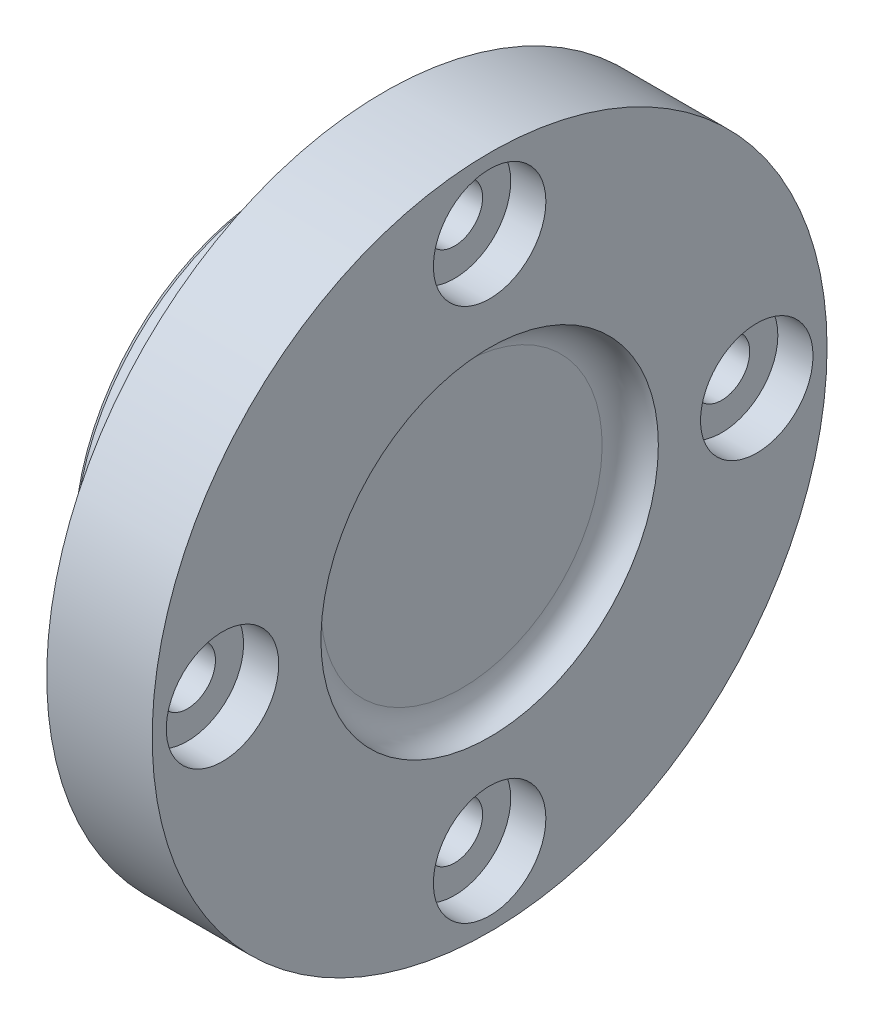
ISO-10303-21;
HEADER;
FILE_DESCRIPTION(('STEP AP214'),'2;1');
FILE_NAME('part.step','',(''),(''),'','','');
FILE_SCHEMA(('AUTOMOTIVE_DESIGN { 1 0 10303 214 1 1 1 1 }'));
ENDSEC;
DATA;
#1=APPLICATION_CONTEXT('core data for automotive mechanical design processes');
#2=APPLICATION_PROTOCOL_DEFINITION('international standard','automotive_design',2000,#1);
#3=PRODUCT_CONTEXT('',#1,'mechanical');
#4=PRODUCT('Part','Part','',(#3));
#5=PRODUCT_RELATED_PRODUCT_CATEGORY('part','',(#4));
#6=PRODUCT_DEFINITION_FORMATION('','',#4);
#7=PRODUCT_DEFINITION_CONTEXT('part definition',#1,'design');
#8=PRODUCT_DEFINITION('design','',#6,#7);
#9=PRODUCT_DEFINITION_SHAPE('','',#8);
#10=(LENGTH_UNIT() NAMED_UNIT(*) SI_UNIT(.MILLI.,.METRE.));
#11=(NAMED_UNIT(*) PLANE_ANGLE_UNIT() SI_UNIT($,.RADIAN.));
#12=(NAMED_UNIT(*) SI_UNIT($,.STERADIAN.) SOLID_ANGLE_UNIT());
#13=UNCERTAINTY_MEASURE_WITH_UNIT(LENGTH_MEASURE(1.E-05),#10,'distance_accuracy_value','');
#14=(GEOMETRIC_REPRESENTATION_CONTEXT(3) GLOBAL_UNCERTAINTY_ASSIGNED_CONTEXT((#13)) GLOBAL_UNIT_ASSIGNED_CONTEXT((#10,
#11,#12)) REPRESENTATION_CONTEXT('',''));
#15=CARTESIAN_POINT('',(0.,0.,0.));
#16=DIRECTION('',(0.,0.,1.));
#17=DIRECTION('',(1.,0.,0.));
#18=AXIS2_PLACEMENT_3D('',#15,#16,#17);
#19=CARTESIAN_POINT('',(15.,48.,0.));
#20=DIRECTION('',(-1.,0.,0.));
#21=DIRECTION('',(0.,0.,1.));
#22=AXIS2_PLACEMENT_3D('',#19,#20,#21);
#23=PLANE('',#22);
#24=CARTESIAN_POINT('',(15.,0.,-38.));
#25=DIRECTION('',(-1.,0.,0.));
#26=DIRECTION('',(0.,0.,1.));
#27=AXIS2_PLACEMENT_3D('',#24,#25,#26);
#28=CIRCLE('',#27,4.00000000000001);
#29=CARTESIAN_POINT('',(15.,0.,-34.));
#30=VERTEX_POINT('',#29);
#31=EDGE_CURVE('E152',#30,#30,#28,.T.);
#32=ORIENTED_EDGE('',*,*,#31,.F.);
#33=EDGE_LOOP('',(#32));
#34=FACE_BOUND('',#33,.T.);
#35=CARTESIAN_POINT('',(15.,38.,0.));
#36=DIRECTION('',(-1.,0.,0.));
#37=DIRECTION('',(0.,0.,1.));
#38=AXIS2_PLACEMENT_3D('',#35,#36,#37);
#39=CIRCLE('',#38,4.00000000000001);
#40=CARTESIAN_POINT('',(15.,38.,4.00000000000001));
#41=VERTEX_POINT('',#40);
#42=EDGE_CURVE('E140',#41,#41,#39,.T.);
#43=ORIENTED_EDGE('',*,*,#42,.F.);
#44=EDGE_LOOP('',(#43));
#45=FACE_BOUND('',#44,.T.);
#46=CARTESIAN_POINT('',(15.,-38.,0.));
#47=DIRECTION('',(-1.,0.,0.));
#48=DIRECTION('',(0.,0.,1.));
#49=AXIS2_PLACEMENT_3D('',#46,#47,#48);
#50=CIRCLE('',#49,4.00000000000001);
#51=CARTESIAN_POINT('',(15.,-38.,4.00000000000002));
#52=VERTEX_POINT('',#51);
#53=EDGE_CURVE('E128',#52,#52,#50,.T.);
#54=ORIENTED_EDGE('',*,*,#53,.F.);
#55=EDGE_LOOP('',(#54));
#56=FACE_BOUND('',#55,.T.);
#57=CARTESIAN_POINT('',(15.,0.,38.));
#58=DIRECTION('',(-1.,0.,0.));
#59=DIRECTION('',(0.,0.,1.));
#60=AXIS2_PLACEMENT_3D('',#57,#58,#59);
#61=CIRCLE('',#60,4.00000000000001);
#62=CARTESIAN_POINT('',(15.,0.,42.));
#63=VERTEX_POINT('',#62);
#64=EDGE_CURVE('E116',#63,#63,#61,.T.);
#65=ORIENTED_EDGE('',*,*,#64,.F.);
#66=EDGE_LOOP('',(#65));
#67=FACE_BOUND('',#66,.T.);
#68=CARTESIAN_POINT('',(15.,0.,0.));
#69=DIRECTION('',(1.,0.,0.));
#70=DIRECTION('',(0.,0.,-1.));
#71=AXIS2_PLACEMENT_3D('',#68,#69,#70);
#72=CIRCLE('',#71,48.);
#73=CARTESIAN_POINT('',(15.,0.,-48.));
#74=VERTEX_POINT('',#73);
#75=EDGE_CURVE('E199',#74,#74,#72,.T.);
#76=ORIENTED_EDGE('',*,*,#75,.F.);
#77=EDGE_LOOP('',(#76));
#78=FACE_BOUND('',#77,.T.);
#79=CARTESIAN_POINT('',(15.,0.,0.));
#80=DIRECTION('',(-1.,0.,0.));
#81=DIRECTION('',(0.,0.,1.));
#82=AXIS2_PLACEMENT_3D('',#79,#80,#81);
#83=CIRCLE('',#82,30.);
#84=CARTESIAN_POINT('',(15.,0.,30.));
#85=VERTEX_POINT('',#84);
#86=EDGE_CURVE('E200',#85,#85,#83,.T.);
#87=ORIENTED_EDGE('',*,*,#86,.F.);
#88=EDGE_LOOP('',(#87));
#89=FACE_BOUND('',#88,.T.);
#90=ADVANCED_FACE('F46',(#34,#45,#56,#67,#78,#89),#23,.T.);
#91=CARTESIAN_POINT('',(15.,0.,0.));
#92=DIRECTION('',(1.,0.,0.));
#93=DIRECTION('',(0.,0.,-1.));
#94=AXIS2_PLACEMENT_3D('',#91,#92,#93);
#95=CYLINDRICAL_SURFACE('',#94,48.);
#96=ORIENTED_EDGE('',*,*,#75,.T.);
#97=EDGE_LOOP('',(#96));
#98=FACE_BOUND('',#97,.T.);
#99=CARTESIAN_POINT('',(30.,0.,0.));
#100=DIRECTION('',(1.,0.,0.));
#101=DIRECTION('',(0.,0.,-1.));
#102=AXIS2_PLACEMENT_3D('',#99,#100,#101);
#103=CIRCLE('',#102,48.);
#104=CARTESIAN_POINT('',(30.,0.,-48.));
#105=VERTEX_POINT('',#104);
#106=EDGE_CURVE('E197',#105,#105,#103,.T.);
#107=ORIENTED_EDGE('',*,*,#106,.F.);
#108=EDGE_LOOP('',(#107));
#109=FACE_BOUND('',#108,.T.);
#110=ADVANCED_FACE('F48',(#98,#109),#95,.T.);
#111=CARTESIAN_POINT('',(30.,0.,0.));
#112=DIRECTION('',(1.,0.,0.));
#113=DIRECTION('',(0.,0.,-1.));
#114=AXIS2_PLACEMENT_3D('',#111,#112,#113);
#115=PLANE('',#114);
#116=CARTESIAN_POINT('',(30.,0.,-38.));
#117=DIRECTION('',(1.,0.,0.));
#118=DIRECTION('',(0.,0.,-1.));
#119=AXIS2_PLACEMENT_3D('',#116,#117,#118);
#120=CIRCLE('',#119,8.00000000000001);
#121=CARTESIAN_POINT('',(30.,0.,-46.));
#122=VERTEX_POINT('',#121);
#123=EDGE_CURVE('E155',#122,#122,#120,.T.);
#124=ORIENTED_EDGE('',*,*,#123,.F.);
#125=EDGE_LOOP('',(#124));
#126=FACE_BOUND('',#125,.T.);
#127=CARTESIAN_POINT('',(30.,38.,0.));
#128=DIRECTION('',(1.,0.,0.));
#129=DIRECTION('',(0.,0.,-1.));
#130=AXIS2_PLACEMENT_3D('',#127,#128,#129);
#131=CIRCLE('',#130,8.00000000000001);
#132=CARTESIAN_POINT('',(30.,38.,-8.00000000000001));
#133=VERTEX_POINT('',#132);
#134=EDGE_CURVE('E143',#133,#133,#131,.T.);
#135=ORIENTED_EDGE('',*,*,#134,.F.);
#136=EDGE_LOOP('',(#135));
#137=FACE_BOUND('',#136,.T.);
#138=CARTESIAN_POINT('',(30.,-38.,0.));
#139=DIRECTION('',(1.,0.,0.));
#140=DIRECTION('',(0.,0.,-1.));
#141=AXIS2_PLACEMENT_3D('',#138,#139,#140);
#142=CIRCLE('',#141,8.00000000000001);
#143=CARTESIAN_POINT('',(30.,-38.,-8.00000000000001));
#144=VERTEX_POINT('',#143);
#145=EDGE_CURVE('E131',#144,#144,#142,.T.);
#146=ORIENTED_EDGE('',*,*,#145,.F.);
#147=EDGE_LOOP('',(#146));
#148=FACE_BOUND('',#147,.T.);
#149=CARTESIAN_POINT('',(30.,0.,38.));
#150=DIRECTION('',(1.,0.,0.));
#151=DIRECTION('',(0.,0.,-1.));
#152=AXIS2_PLACEMENT_3D('',#149,#150,#151);
#153=CIRCLE('',#152,8.00000000000001);
#154=CARTESIAN_POINT('',(30.,0.,30.));
#155=VERTEX_POINT('',#154);
#156=EDGE_CURVE('E119',#155,#155,#153,.T.);
#157=ORIENTED_EDGE('',*,*,#156,.F.);
#158=EDGE_LOOP('',(#157));
#159=FACE_BOUND('',#158,.T.);
#160=CARTESIAN_POINT('',(30.,0.,0.));
#161=DIRECTION('',(1.,0.,0.));
#162=DIRECTION('',(0.,0.,-1.));
#163=AXIS2_PLACEMENT_3D('',#160,#161,#162);
#164=CIRCLE('',#163,24.);
#165=CARTESIAN_POINT('',(30.,0.,-24.));
#166=VERTEX_POINT('',#165);
#167=EDGE_CURVE('E82',#166,#166,#164,.F.);
#168=ORIENTED_EDGE('',*,*,#167,.T.);
#169=EDGE_LOOP('',(#168));
#170=FACE_BOUND('',#169,.T.);
#171=ORIENTED_EDGE('',*,*,#106,.T.);
#172=EDGE_LOOP('',(#171));
#173=FACE_BOUND('',#172,.T.);
#174=ADVANCED_FACE('F181',(#126,#137,#148,#159,#170,#173),#115,.T.);
#175=CARTESIAN_POINT('',(0.,0.,0.));
#176=DIRECTION('',(1.,0.,0.));
#177=DIRECTION('',(0.,0.,-1.));
#178=AXIS2_PLACEMENT_3D('',#175,#176,#177);
#179=CYLINDRICAL_SURFACE('',#178,30.);
#180=CARTESIAN_POINT('',(1.,0.,0.));
#181=DIRECTION('',(-1.,0.,0.));
#182=DIRECTION('',(0.,0.,1.));
#183=AXIS2_PLACEMENT_3D('',#180,#181,#182);
#184=CIRCLE('',#183,30.);
#185=CARTESIAN_POINT('',(1.,0.,30.));
#186=VERTEX_POINT('',#185);
#187=EDGE_CURVE('E11',#186,#186,#184,.F.);
#188=ORIENTED_EDGE('',*,*,#187,.T.);
#189=EDGE_LOOP('',(#188));
#190=FACE_BOUND('',#189,.T.);
#191=ORIENTED_EDGE('',*,*,#86,.T.);
#192=EDGE_LOOP('',(#191));
#193=FACE_BOUND('',#192,.T.);
#194=ADVANCED_FACE('F184',(#190,#193),#179,.T.);
#195=CARTESIAN_POINT('',(0.,0.,0.));
#196=DIRECTION('',(-1.,0.,0.));
#197=DIRECTION('',(0.,0.,1.));
#198=AXIS2_PLACEMENT_3D('',#195,#196,#197);
#199=PLANE('',#198);
#200=CARTESIAN_POINT('',(0.,0.,0.));
#201=DIRECTION('',(-1.,0.,0.));
#202=DIRECTION('',(0.,0.,1.));
#203=AXIS2_PLACEMENT_3D('',#200,#201,#202);
#204=CIRCLE('',#203,23.);
#205=CARTESIAN_POINT('',(0.,0.,23.));
#206=VERTEX_POINT('',#205);
#207=EDGE_CURVE('E54',#206,#206,#204,.F.);
#208=ORIENTED_EDGE('',*,*,#207,.T.);
#209=EDGE_LOOP('',(#208));
#210=FACE_BOUND('',#209,.T.);
#211=CARTESIAN_POINT('',(0.,0.,0.));
#212=DIRECTION('',(-1.,0.,0.));
#213=DIRECTION('',(0.,0.,1.));
#214=AXIS2_PLACEMENT_3D('',#211,#212,#213);
#215=CIRCLE('',#214,29.);
#216=CARTESIAN_POINT('',(0.,0.,29.));
#217=VERTEX_POINT('',#216);
#218=EDGE_CURVE('E212',#217,#217,#215,.T.);
#219=ORIENTED_EDGE('',*,*,#218,.T.);
#220=EDGE_LOOP('',(#219));
#221=FACE_BOUND('',#220,.T.);
#222=ADVANCED_FACE('F217',(#210,#221),#199,.T.);
#223=CARTESIAN_POINT('',(0.,0.,0.));
#224=DIRECTION('',(-1.,0.,0.));
#225=DIRECTION('',(0.,0.,1.));
#226=AXIS2_PLACEMENT_3D('',#223,#224,#225);
#227=CYLINDRICAL_SURFACE('',#226,22.);
#228=CARTESIAN_POINT('',(0.99999999999997,0.,0.));
#229=DIRECTION('',(-1.,0.,0.));
#230=DIRECTION('',(0.,0.,1.));
#231=AXIS2_PLACEMENT_3D('',#228,#229,#230);
#232=CIRCLE('',#231,22.);
#233=CARTESIAN_POINT('',(0.99999999999997,0.,22.));
#234=VERTEX_POINT('',#233);
#235=EDGE_CURVE('E203',#234,#234,#232,.T.);
#236=ORIENTED_EDGE('',*,*,#235,.T.);
#237=EDGE_LOOP('',(#236));
#238=FACE_BOUND('',#237,.T.);
#239=CARTESIAN_POINT('',(18.,0.,0.));
#240=DIRECTION('',(-1.,0.,0.));
#241=DIRECTION('',(0.,0.,1.));
#242=AXIS2_PLACEMENT_3D('',#239,#240,#241);
#243=CIRCLE('',#242,22.);
#244=CARTESIAN_POINT('',(18.,0.,22.));
#245=VERTEX_POINT('',#244);
#246=EDGE_CURVE('E206',#245,#245,#243,.T.);
#247=ORIENTED_EDGE('',*,*,#246,.F.);
#248=EDGE_LOOP('',(#247));
#249=FACE_BOUND('',#248,.T.);
#250=ADVANCED_FACE('F226',(#238,#249),#227,.F.);
#251=CARTESIAN_POINT('',(18.,0.,0.));
#252=DIRECTION('',(1.,0.,0.));
#253=DIRECTION('',(0.,0.,-1.));
#254=AXIS2_PLACEMENT_3D('',#251,#252,#253);
#255=PLANE('',#254);
#256=CARTESIAN_POINT('',(18.,0.,0.));
#257=DIRECTION('',(1.,0.,0.));
#258=DIRECTION('',(0.,0.,-1.));
#259=AXIS2_PLACEMENT_3D('',#256,#257,#258);
#260=CIRCLE('',#259,20.);
#261=CARTESIAN_POINT('',(18.,0.,-20.));
#262=VERTEX_POINT('',#261);
#263=EDGE_CURVE('E88',#262,#262,#260,.F.);
#264=ORIENTED_EDGE('',*,*,#263,.F.);
#265=EDGE_LOOP('',(#264));
#266=FACE_BOUND('',#265,.T.);
#267=ORIENTED_EDGE('',*,*,#246,.T.);
#268=EDGE_LOOP('',(#267));
#269=FACE_BOUND('',#268,.T.);
#270=ADVANCED_FACE('F229',(#266,#269),#255,.F.);
#271=CARTESIAN_POINT('',(18.,0.,0.));
#272=DIRECTION('',(1.,0.,0.));
#273=DIRECTION('',(0.,0.877582561890372,0.479425538604204));
#274=AXIS2_PLACEMENT_3D('',#271,#272,#273);
#275=TOROIDAL_SURFACE('',#274,16.,4.);
#276=CARTESIAN_POINT('',(22.,0.,0.));
#277=DIRECTION('',(1.,0.,0.));
#278=DIRECTION('',(0.,-0.87758256188964,-0.479425538605544));
#279=AXIS2_PLACEMENT_3D('',#276,#277,#278);
#280=CIRCLE('',#279,15.999999999961);
#281=CARTESIAN_POINT('',(22.,14.0413209902105,7.670808617659));
#282=VERTEX_POINT('',#281);
#283=CARTESIAN_POINT('',(22.,-14.0413209902034,-7.67080861767187));
#284=VERTEX_POINT('',#283);
#285=EDGE_CURVE('E60',#282,#284,#280,.F.);
#286=ORIENTED_EDGE('',*,*,#285,.F.);
#287=CARTESIAN_POINT('',(22.,0.,0.));
#288=DIRECTION('',(1.,0.,0.));
#289=DIRECTION('',(0.,0.877582561890373,0.479425538604204));
#290=AXIS2_PLACEMENT_3D('',#287,#288,#289);
#291=CIRCLE('',#290,15.999999999961);
#292=EDGE_CURVE('E234',#284,#282,#291,.F.);
#293=ORIENTED_EDGE('',*,*,#292,.F.);
#294=EDGE_LOOP('',(#286,#293));
#295=FACE_BOUND('',#294,.T.);
#296=ORIENTED_EDGE('',*,*,#263,.T.);
#297=EDGE_LOOP('',(#296));
#298=FACE_BOUND('',#297,.T.);
#299=ADVANCED_FACE('F253',(#295,#298),#275,.F.);
#300=CARTESIAN_POINT('',(22.,16.,0.));
#301=DIRECTION('',(1.,0.,0.));
#302=DIRECTION('',(0.,0.,-1.));
#303=AXIS2_PLACEMENT_3D('',#300,#301,#302);
#304=PLANE('',#303);
#305=ORIENTED_EDGE('',*,*,#285,.T.);
#306=ORIENTED_EDGE('',*,*,#292,.T.);
#307=EDGE_LOOP('',(#305,#306));
#308=FACE_BOUND('',#307,.T.);
#309=ADVANCED_FACE('F106',(#308),#304,.F.);
#310=CARTESIAN_POINT('',(30.,0.,0.));
#311=DIRECTION('',(1.,0.,0.));
#312=DIRECTION('',(0.,0.877582561890372,0.479425538604204));
#313=AXIS2_PLACEMENT_3D('',#310,#311,#312);
#314=TOROIDAL_SURFACE('',#313,20.,4.);
#315=ORIENTED_EDGE('',*,*,#167,.F.);
#316=EDGE_LOOP('',(#315));
#317=FACE_BOUND('',#316,.T.);
#318=CARTESIAN_POINT('',(26.,0.,0.));
#319=DIRECTION('',(-1.,0.,0.));
#320=DIRECTION('',(0.,0.877582561890373,0.479425538604203));
#321=AXIS2_PLACEMENT_3D('',#318,#319,#320);
#322=CIRCLE('',#321,19.9999999999958);
#323=CARTESIAN_POINT('',(26.,-17.551651237804,-9.58851077207623));
#324=VERTEX_POINT('',#323);
#325=CARTESIAN_POINT('',(26.,17.5516512378015,9.58851077208082));
#326=VERTEX_POINT('',#325);
#327=EDGE_CURVE('E73',#324,#326,#322,.F.);
#328=ORIENTED_EDGE('',*,*,#327,.F.);
#329=CARTESIAN_POINT('',(26.,0.,0.));
#330=DIRECTION('',(-1.,0.,0.));
#331=DIRECTION('',(0.,-0.877582561890373,-0.479425538604203));
#332=AXIS2_PLACEMENT_3D('',#329,#330,#331);
#333=CIRCLE('',#332,19.9999999999915);
#334=EDGE_CURVE('E77',#326,#324,#333,.F.);
#335=ORIENTED_EDGE('',*,*,#334,.F.);
#336=EDGE_LOOP('',(#328,#335));
#337=FACE_BOUND('',#336,.T.);
#338=ADVANCED_FACE('F86',(#317,#337),#314,.F.);
#339=CARTESIAN_POINT('',(26.,0.,0.));
#340=DIRECTION('',(1.,0.,0.));
#341=DIRECTION('',(0.,0.,-1.));
#342=AXIS2_PLACEMENT_3D('',#339,#340,#341);
#343=PLANE('',#342);
#344=ORIENTED_EDGE('',*,*,#334,.T.);
#345=ORIENTED_EDGE('',*,*,#327,.T.);
#346=EDGE_LOOP('',(#344,#345));
#347=FACE_BOUND('',#346,.T.);
#348=ADVANCED_FACE('F76',(#347),#343,.T.);
#349=CARTESIAN_POINT('',(30.,0.,38.));
#350=DIRECTION('',(1.,0.,0.));
#351=DIRECTION('',(0.,0.,-1.));
#352=AXIS2_PLACEMENT_3D('',#349,#350,#351);
#353=CYLINDRICAL_SURFACE('',#352,4.00000000000001);
#354=CARTESIAN_POINT('',(25.,0.,38.));
#355=DIRECTION('',(1.,0.,0.));
#356=DIRECTION('',(0.,0.,-1.));
#357=AXIS2_PLACEMENT_3D('',#354,#355,#356);
#358=CIRCLE('',#357,4.00000000000001);
#359=CARTESIAN_POINT('',(25.,0.,34.));
#360=VERTEX_POINT('',#359);
#361=EDGE_CURVE('E125',#360,#360,#358,.T.);
#362=ORIENTED_EDGE('',*,*,#361,.T.);
#363=EDGE_LOOP('',(#362));
#364=FACE_BOUND('',#363,.T.);
#365=ORIENTED_EDGE('',*,*,#64,.T.);
#366=EDGE_LOOP('',(#365));
#367=FACE_BOUND('',#366,.T.);
#368=ADVANCED_FACE('F108',(#364,#367),#353,.F.);
#369=CARTESIAN_POINT('',(30.,0.,38.));
#370=DIRECTION('',(1.,0.,0.));
#371=DIRECTION('',(0.,0.,-1.));
#372=AXIS2_PLACEMENT_3D('',#369,#370,#371);
#373=CYLINDRICAL_SURFACE('',#372,8.00000000000001);
#374=CARTESIAN_POINT('',(25.,0.,38.));
#375=DIRECTION('',(1.,0.,0.));
#376=DIRECTION('',(0.,0.,-1.));
#377=AXIS2_PLACEMENT_3D('',#374,#375,#376);
#378=CIRCLE('',#377,8.00000000000001);
#379=CARTESIAN_POINT('',(25.,0.,30.));
#380=VERTEX_POINT('',#379);
#381=EDGE_CURVE('E122',#380,#380,#378,.T.);
#382=ORIENTED_EDGE('',*,*,#381,.F.);
#383=EDGE_LOOP('',(#382));
#384=FACE_BOUND('',#383,.T.);
#385=ORIENTED_EDGE('',*,*,#156,.T.);
#386=EDGE_LOOP('',(#385));
#387=FACE_BOUND('',#386,.T.);
#388=ADVANCED_FACE('F109',(#384,#387),#373,.F.);
#389=CARTESIAN_POINT('',(25.,4.00000000000001,38.));
#390=DIRECTION('',(-1.,0.,0.));
#391=DIRECTION('',(0.,0.,1.));
#392=AXIS2_PLACEMENT_3D('',#389,#390,#391);
#393=PLANE('',#392);
#394=ORIENTED_EDGE('',*,*,#361,.F.);
#395=EDGE_LOOP('',(#394));
#396=FACE_BOUND('',#395,.T.);
#397=ORIENTED_EDGE('',*,*,#381,.T.);
#398=EDGE_LOOP('',(#397));
#399=FACE_BOUND('',#398,.T.);
#400=ADVANCED_FACE('F362',(#396,#399),#393,.F.);
#401=CARTESIAN_POINT('',(30.,-38.,0.));
#402=DIRECTION('',(1.,0.,0.));
#403=DIRECTION('',(0.,0.,-1.));
#404=AXIS2_PLACEMENT_3D('',#401,#402,#403);
#405=CYLINDRICAL_SURFACE('',#404,4.00000000000001);
#406=CARTESIAN_POINT('',(25.,-38.,0.));
#407=DIRECTION('',(1.,0.,0.));
#408=DIRECTION('',(0.,0.,-1.));
#409=AXIS2_PLACEMENT_3D('',#406,#407,#408);
#410=CIRCLE('',#409,4.00000000000001);
#411=CARTESIAN_POINT('',(25.,-38.,-4.00000000000001));
#412=VERTEX_POINT('',#411);
#413=EDGE_CURVE('E137',#412,#412,#410,.T.);
#414=ORIENTED_EDGE('',*,*,#413,.T.);
#415=EDGE_LOOP('',(#414));
#416=FACE_BOUND('',#415,.T.);
#417=ORIENTED_EDGE('',*,*,#53,.T.);
#418=EDGE_LOOP('',(#417));
#419=FACE_BOUND('',#418,.T.);
#420=ADVANCED_FACE('F370',(#416,#419),#405,.F.);
#421=CARTESIAN_POINT('',(30.,-38.,0.));
#422=DIRECTION('',(1.,0.,0.));
#423=DIRECTION('',(0.,0.,-1.));
#424=AXIS2_PLACEMENT_3D('',#421,#422,#423);
#425=CYLINDRICAL_SURFACE('',#424,8.00000000000001);
#426=CARTESIAN_POINT('',(25.,-38.,0.));
#427=DIRECTION('',(1.,0.,0.));
#428=DIRECTION('',(0.,0.,-1.));
#429=AXIS2_PLACEMENT_3D('',#426,#427,#428);
#430=CIRCLE('',#429,8.00000000000001);
#431=CARTESIAN_POINT('',(25.,-38.,-8.00000000000001));
#432=VERTEX_POINT('',#431);
#433=EDGE_CURVE('E134',#432,#432,#430,.T.);
#434=ORIENTED_EDGE('',*,*,#433,.F.);
#435=EDGE_LOOP('',(#434));
#436=FACE_BOUND('',#435,.T.);
#437=ORIENTED_EDGE('',*,*,#145,.T.);
#438=EDGE_LOOP('',(#437));
#439=FACE_BOUND('',#438,.T.);
#440=ADVANCED_FACE('F378',(#436,#439),#425,.F.);
#441=CARTESIAN_POINT('',(25.,-34.,0.));
#442=DIRECTION('',(-1.,0.,0.));
#443=DIRECTION('',(0.,0.,1.));
#444=AXIS2_PLACEMENT_3D('',#441,#442,#443);
#445=PLANE('',#444);
#446=ORIENTED_EDGE('',*,*,#413,.F.);
#447=EDGE_LOOP('',(#446));
#448=FACE_BOUND('',#447,.T.);
#449=ORIENTED_EDGE('',*,*,#433,.T.);
#450=EDGE_LOOP('',(#449));
#451=FACE_BOUND('',#450,.T.);
#452=ADVANCED_FACE('F387',(#448,#451),#445,.F.);
#453=CARTESIAN_POINT('',(30.,38.,0.));
#454=DIRECTION('',(1.,0.,0.));
#455=DIRECTION('',(0.,0.,-1.));
#456=AXIS2_PLACEMENT_3D('',#453,#454,#455);
#457=CYLINDRICAL_SURFACE('',#456,4.00000000000001);
#458=CARTESIAN_POINT('',(25.,38.,0.));
#459=DIRECTION('',(1.,0.,0.));
#460=DIRECTION('',(0.,0.,-1.));
#461=AXIS2_PLACEMENT_3D('',#458,#459,#460);
#462=CIRCLE('',#461,4.00000000000001);
#463=CARTESIAN_POINT('',(25.,38.,-4.00000000000001));
#464=VERTEX_POINT('',#463);
#465=EDGE_CURVE('E149',#464,#464,#462,.T.);
#466=ORIENTED_EDGE('',*,*,#465,.T.);
#467=EDGE_LOOP('',(#466));
#468=FACE_BOUND('',#467,.T.);
#469=ORIENTED_EDGE('',*,*,#42,.T.);
#470=EDGE_LOOP('',(#469));
#471=FACE_BOUND('',#470,.T.);
#472=ADVANCED_FACE('F396',(#468,#471),#457,.F.);
#473=CARTESIAN_POINT('',(30.,38.,0.));
#474=DIRECTION('',(1.,0.,0.));
#475=DIRECTION('',(0.,0.,-1.));
#476=AXIS2_PLACEMENT_3D('',#473,#474,#475);
#477=CYLINDRICAL_SURFACE('',#476,8.00000000000001);
#478=CARTESIAN_POINT('',(25.,38.,0.));
#479=DIRECTION('',(1.,0.,0.));
#480=DIRECTION('',(0.,0.,-1.));
#481=AXIS2_PLACEMENT_3D('',#478,#479,#480);
#482=CIRCLE('',#481,8.00000000000001);
#483=CARTESIAN_POINT('',(25.,38.,-8.00000000000001));
#484=VERTEX_POINT('',#483);
#485=EDGE_CURVE('E146',#484,#484,#482,.T.);
#486=ORIENTED_EDGE('',*,*,#485,.F.);
#487=EDGE_LOOP('',(#486));
#488=FACE_BOUND('',#487,.T.);
#489=ORIENTED_EDGE('',*,*,#134,.T.);
#490=EDGE_LOOP('',(#489));
#491=FACE_BOUND('',#490,.T.);
#492=ADVANCED_FACE('F405',(#488,#491),#477,.F.);
#493=CARTESIAN_POINT('',(25.,42.,0.));
#494=DIRECTION('',(-1.,0.,0.));
#495=DIRECTION('',(0.,0.,1.));
#496=AXIS2_PLACEMENT_3D('',#493,#494,#495);
#497=PLANE('',#496);
#498=ORIENTED_EDGE('',*,*,#465,.F.);
#499=EDGE_LOOP('',(#498));
#500=FACE_BOUND('',#499,.T.);
#501=ORIENTED_EDGE('',*,*,#485,.T.);
#502=EDGE_LOOP('',(#501));
#503=FACE_BOUND('',#502,.T.);
#504=ADVANCED_FACE('F414',(#500,#503),#497,.F.);
#505=CARTESIAN_POINT('',(30.,0.,-38.));
#506=DIRECTION('',(1.,0.,0.));
#507=DIRECTION('',(0.,0.,-1.));
#508=AXIS2_PLACEMENT_3D('',#505,#506,#507);
#509=CYLINDRICAL_SURFACE('',#508,4.00000000000001);
#510=CARTESIAN_POINT('',(25.,0.,-38.));
#511=DIRECTION('',(1.,0.,0.));
#512=DIRECTION('',(0.,0.,-1.));
#513=AXIS2_PLACEMENT_3D('',#510,#511,#512);
#514=CIRCLE('',#513,4.00000000000001);
#515=CARTESIAN_POINT('',(25.,0.,-42.));
#516=VERTEX_POINT('',#515);
#517=EDGE_CURVE('E161',#516,#516,#514,.T.);
#518=ORIENTED_EDGE('',*,*,#517,.T.);
#519=EDGE_LOOP('',(#518));
#520=FACE_BOUND('',#519,.T.);
#521=ORIENTED_EDGE('',*,*,#31,.T.);
#522=EDGE_LOOP('',(#521));
#523=FACE_BOUND('',#522,.T.);
#524=ADVANCED_FACE('F165',(#520,#523),#509,.F.);
#525=CARTESIAN_POINT('',(30.,0.,-38.));
#526=DIRECTION('',(1.,0.,0.));
#527=DIRECTION('',(0.,0.,-1.));
#528=AXIS2_PLACEMENT_3D('',#525,#526,#527);
#529=CYLINDRICAL_SURFACE('',#528,8.00000000000001);
#530=CARTESIAN_POINT('',(25.,0.,-38.));
#531=DIRECTION('',(1.,0.,0.));
#532=DIRECTION('',(0.,0.,-1.));
#533=AXIS2_PLACEMENT_3D('',#530,#531,#532);
#534=CIRCLE('',#533,8.00000000000001);
#535=CARTESIAN_POINT('',(25.,0.,-46.));
#536=VERTEX_POINT('',#535);
#537=EDGE_CURVE('E158',#536,#536,#534,.T.);
#538=ORIENTED_EDGE('',*,*,#537,.F.);
#539=EDGE_LOOP('',(#538));
#540=FACE_BOUND('',#539,.T.);
#541=ORIENTED_EDGE('',*,*,#123,.T.);
#542=EDGE_LOOP('',(#541));
#543=FACE_BOUND('',#542,.T.);
#544=ADVANCED_FACE('F172',(#540,#543),#529,.F.);
#545=CARTESIAN_POINT('',(25.,4.,-38.));
#546=DIRECTION('',(-1.,0.,0.));
#547=DIRECTION('',(0.,0.,1.));
#548=AXIS2_PLACEMENT_3D('',#545,#546,#547);
#549=PLANE('',#548);
#550=ORIENTED_EDGE('',*,*,#517,.F.);
#551=EDGE_LOOP('',(#550));
#552=FACE_BOUND('',#551,.T.);
#553=ORIENTED_EDGE('',*,*,#537,.T.);
#554=EDGE_LOOP('',(#553));
#555=FACE_BOUND('',#554,.T.);
#556=ADVANCED_FACE('F168',(#552,#555),#549,.F.);
#557=CARTESIAN_POINT('',(0.99999999999997,0.,0.));
#558=DIRECTION('',(-1.,0.,0.));
#559=DIRECTION('',(0.,0.,1.));
#560=AXIS2_PLACEMENT_3D('',#557,#558,#559);
#561=CONICAL_SURFACE('',#560,22.,0.785398163397454);
#562=ORIENTED_EDGE('',*,*,#207,.F.);
#563=EDGE_LOOP('',(#562));
#564=FACE_BOUND('',#563,.T.);
#565=ORIENTED_EDGE('',*,*,#235,.F.);
#566=EDGE_LOOP('',(#565));
#567=FACE_BOUND('',#566,.T.);
#568=ADVANCED_FACE('F171',(#564,#567),#561,.F.);
#569=CARTESIAN_POINT('',(0.,0.,0.));
#570=DIRECTION('',(1.,0.,0.));
#571=DIRECTION('',(0.,0.,-1.));
#572=AXIS2_PLACEMENT_3D('',#569,#570,#571);
#573=CONICAL_SURFACE('',#572,29.,0.785398163397455);
#574=ORIENTED_EDGE('',*,*,#187,.F.);
#575=EDGE_LOOP('',(#574));
#576=FACE_BOUND('',#575,.T.);
#577=ORIENTED_EDGE('',*,*,#218,.F.);
#578=EDGE_LOOP('',(#577));
#579=FACE_BOUND('',#578,.T.);
#580=ADVANCED_FACE('F222',(#576,#579),#573,.T.);
#581=CLOSED_SHELL('',(#90,#110,#174,#194,#222,#250,#270,#299,#309,#338,#348,#368,#388,#400,#420,
#440,#452,#472,#492,#504,#524,#544,#556,#568,#580));
#582=MANIFOLD_SOLID_BREP('B2',#581);
#583=ADVANCED_BREP_SHAPE_REPRESENTATION('',(#18,#582),#14);
#584=SHAPE_DEFINITION_REPRESENTATION(#9,#583);
ENDSEC;
END-ISO-10303-21;
